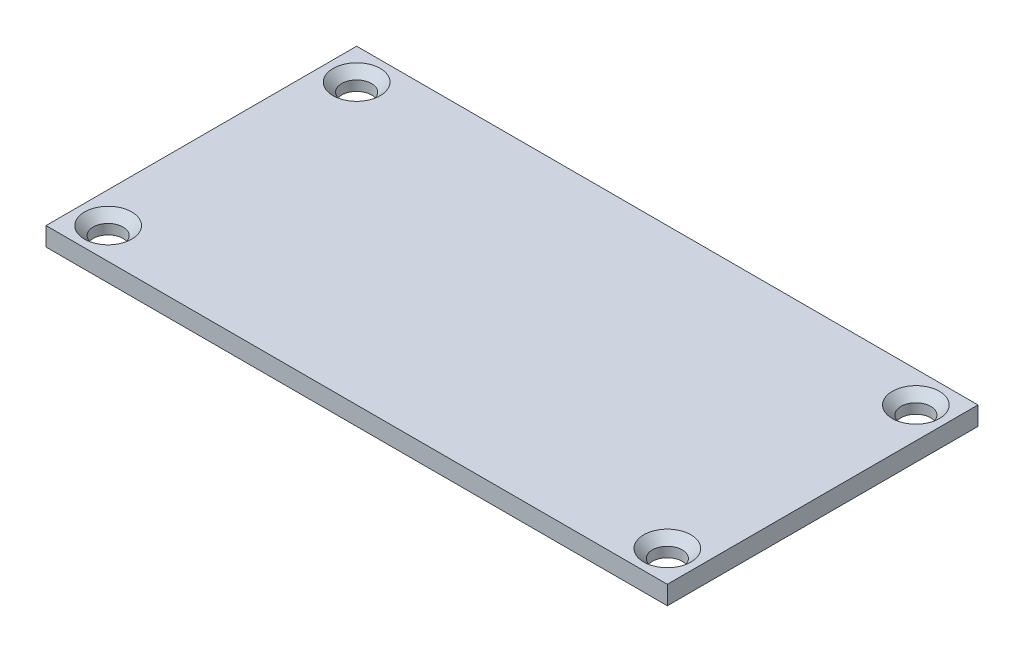
ISO-10303-21;
HEADER;
FILE_DESCRIPTION(('STEP AP214'),'2;1');
FILE_NAME('part.step','',(''),(''),'','','');
FILE_SCHEMA(('AUTOMOTIVE_DESIGN { 1 0 10303 214 1 1 1 1 }'));
ENDSEC;
DATA;
#1=APPLICATION_CONTEXT('core data for automotive mechanical design processes');
#2=APPLICATION_PROTOCOL_DEFINITION('international standard','automotive_design',2000,#1);
#3=PRODUCT_CONTEXT('',#1,'mechanical');
#4=PRODUCT('Part','Part','',(#3));
#5=PRODUCT_RELATED_PRODUCT_CATEGORY('part','',(#4));
#6=PRODUCT_DEFINITION_FORMATION('','',#4);
#7=PRODUCT_DEFINITION_CONTEXT('part definition',#1,'design');
#8=PRODUCT_DEFINITION('design','',#6,#7);
#9=PRODUCT_DEFINITION_SHAPE('','',#8);
#10=(LENGTH_UNIT() NAMED_UNIT(*) SI_UNIT(.MILLI.,.METRE.));
#11=(NAMED_UNIT(*) PLANE_ANGLE_UNIT() SI_UNIT($,.RADIAN.));
#12=(NAMED_UNIT(*) SI_UNIT($,.STERADIAN.) SOLID_ANGLE_UNIT());
#13=UNCERTAINTY_MEASURE_WITH_UNIT(LENGTH_MEASURE(1.E-05),#10,'distance_accuracy_value','');
#14=(GEOMETRIC_REPRESENTATION_CONTEXT(3) GLOBAL_UNCERTAINTY_ASSIGNED_CONTEXT((#13)) GLOBAL_UNIT_ASSIGNED_CONTEXT((#10,
#11,#12)) REPRESENTATION_CONTEXT('',''));
#15=CARTESIAN_POINT('',(0.,0.,0.));
#16=DIRECTION('',(0.,0.,1.));
#17=DIRECTION('',(1.,0.,0.));
#18=AXIS2_PLACEMENT_3D('',#15,#16,#17);
#19=CARTESIAN_POINT('',(47.5,1.5,-2.5));
#20=DIRECTION('',(0.,1.,0.));
#21=DIRECTION('',(0.,0.,1.));
#22=AXIS2_PLACEMENT_3D('',#19,#20,#21);
#23=CONICAL_SURFACE('',#22,1.9,0.78539816339745);
#24=CARTESIAN_POINT('',(47.5,0.800000000000001,-2.5));
#25=DIRECTION('',(0.,1.,0.));
#26=DIRECTION('',(0.,0.,1.));
#27=AXIS2_PLACEMENT_3D('',#24,#25,#26);
#28=CIRCLE('',#27,1.2);
#29=CARTESIAN_POINT('',(47.5,0.800000000000001,-1.3));
#30=VERTEX_POINT('',#29);
#31=EDGE_CURVE('E11',#30,#30,#28,.T.);
#32=ORIENTED_EDGE('',*,*,#31,.F.);
#33=EDGE_LOOP('',(#32));
#34=FACE_BOUND('',#33,.T.);
#35=CARTESIAN_POINT('',(47.5,1.5,-2.5));
#36=DIRECTION('',(0.,1.,0.));
#37=DIRECTION('',(0.,0.,1.));
#38=AXIS2_PLACEMENT_3D('',#35,#36,#37);
#39=CIRCLE('',#38,1.9);
#40=CARTESIAN_POINT('',(47.5,1.5,-0.600000000000002));
#41=VERTEX_POINT('',#40);
#42=EDGE_CURVE('E145',#41,#41,#39,.T.);
#43=ORIENTED_EDGE('',*,*,#42,.T.);
#44=EDGE_LOOP('',(#43));
#45=FACE_BOUND('',#44,.T.);
#46=ADVANCED_FACE('F39',(#34,#45),#23,.F.);
#47=CARTESIAN_POINT('',(47.5,1.5,-2.5));
#48=DIRECTION('',(0.,1.,0.));
#49=DIRECTION('',(0.,0.,1.));
#50=AXIS2_PLACEMENT_3D('',#47,#48,#49);
#51=CYLINDRICAL_SURFACE('',#50,1.2);
#52=CARTESIAN_POINT('',(47.5,0.,-2.5));
#53=DIRECTION('',(0.,-1.,0.));
#54=DIRECTION('',(0.,0.,-1.));
#55=AXIS2_PLACEMENT_3D('',#52,#53,#54);
#56=CIRCLE('',#55,1.2);
#57=CARTESIAN_POINT('',(47.5,0.,-3.7));
#58=VERTEX_POINT('',#57);
#59=EDGE_CURVE('E48',#58,#58,#56,.T.);
#60=ORIENTED_EDGE('',*,*,#59,.T.);
#61=EDGE_LOOP('',(#60));
#62=FACE_BOUND('',#61,.T.);
#63=ORIENTED_EDGE('',*,*,#31,.T.);
#64=EDGE_LOOP('',(#63));
#65=FACE_BOUND('',#64,.T.);
#66=ADVANCED_FACE('F152',(#62,#65),#51,.F.);
#67=CARTESIAN_POINT('',(2.5,1.5,-2.5));
#68=DIRECTION('',(0.,1.,0.));
#69=DIRECTION('',(0.,0.,1.));
#70=AXIS2_PLACEMENT_3D('',#67,#68,#69);
#71=CONICAL_SURFACE('',#70,1.9,0.78539816339745);
#72=CARTESIAN_POINT('',(2.5,0.800000000000001,-2.5));
#73=DIRECTION('',(0.,1.,0.));
#74=DIRECTION('',(0.,0.,1.));
#75=AXIS2_PLACEMENT_3D('',#72,#73,#74);
#76=CIRCLE('',#75,1.2);
#77=CARTESIAN_POINT('',(2.5,0.800000000000001,-1.3));
#78=VERTEX_POINT('',#77);
#79=EDGE_CURVE('E141',#78,#78,#76,.T.);
#80=ORIENTED_EDGE('',*,*,#79,.F.);
#81=EDGE_LOOP('',(#80));
#82=FACE_BOUND('',#81,.T.);
#83=CARTESIAN_POINT('',(2.5,1.5,-2.5));
#84=DIRECTION('',(0.,1.,0.));
#85=DIRECTION('',(0.,0.,1.));
#86=AXIS2_PLACEMENT_3D('',#83,#84,#85);
#87=CIRCLE('',#86,1.9);
#88=CARTESIAN_POINT('',(2.5,1.5,-0.600000000000002));
#89=VERTEX_POINT('',#88);
#90=EDGE_CURVE('E129',#89,#89,#87,.T.);
#91=ORIENTED_EDGE('',*,*,#90,.T.);
#92=EDGE_LOOP('',(#91));
#93=FACE_BOUND('',#92,.T.);
#94=ADVANCED_FACE('F178',(#82,#93),#71,.F.);
#95=CARTESIAN_POINT('',(2.5,1.5,-2.5));
#96=DIRECTION('',(0.,1.,0.));
#97=DIRECTION('',(0.,0.,1.));
#98=AXIS2_PLACEMENT_3D('',#95,#96,#97);
#99=CYLINDRICAL_SURFACE('',#98,1.2);
#100=CARTESIAN_POINT('',(2.5,0.,-2.5));
#101=DIRECTION('',(0.,-1.,0.));
#102=DIRECTION('',(0.,0.,-1.));
#103=AXIS2_PLACEMENT_3D('',#100,#101,#102);
#104=CIRCLE('',#103,1.2);
#105=CARTESIAN_POINT('',(2.5,0.,-3.7));
#106=VERTEX_POINT('',#105);
#107=EDGE_CURVE('E137',#106,#106,#104,.T.);
#108=ORIENTED_EDGE('',*,*,#107,.T.);
#109=EDGE_LOOP('',(#108));
#110=FACE_BOUND('',#109,.T.);
#111=ORIENTED_EDGE('',*,*,#79,.T.);
#112=EDGE_LOOP('',(#111));
#113=FACE_BOUND('',#112,.T.);
#114=ADVANCED_FACE('F186',(#110,#113),#99,.F.);
#115=CARTESIAN_POINT('',(0.,1.5,0.));
#116=DIRECTION('',(1.,0.,0.));
#117=DIRECTION('',(0.,0.,-1.));
#118=AXIS2_PLACEMENT_3D('',#115,#116,#117);
#119=PLANE('',#118);
#120=DIRECTION('',(0.,0.,1.));
#121=VECTOR('',#120,1.);
#122=CARTESIAN_POINT('',(0.,0.,0.));
#123=LINE('',#122,#121);
#124=CARTESIAN_POINT('',(0.,0.,-25.));
#125=VERTEX_POINT('',#124);
#126=CARTESIAN_POINT('',(0.,0.,0.));
#127=VERTEX_POINT('',#126);
#128=EDGE_CURVE('E112',#125,#127,#123,.T.);
#129=ORIENTED_EDGE('',*,*,#128,.T.);
#130=DIRECTION('',(0.,-1.,0.));
#131=VECTOR('',#130,1.);
#132=CARTESIAN_POINT('',(0.,1.5,0.));
#133=LINE('',#132,#131);
#134=CARTESIAN_POINT('',(0.,1.5,0.));
#135=VERTEX_POINT('',#134);
#136=EDGE_CURVE('E101',#135,#127,#133,.T.);
#137=ORIENTED_EDGE('',*,*,#136,.F.);
#138=DIRECTION('',(0.,0.,1.));
#139=VECTOR('',#138,1.);
#140=CARTESIAN_POINT('',(0.,1.5,0.));
#141=LINE('',#140,#139);
#142=CARTESIAN_POINT('',(0.,1.5,-25.));
#143=VERTEX_POINT('',#142);
#144=EDGE_CURVE('E93',#143,#135,#141,.T.);
#145=ORIENTED_EDGE('',*,*,#144,.F.);
#146=DIRECTION('',(0.,-1.,0.));
#147=VECTOR('',#146,1.);
#148=CARTESIAN_POINT('',(0.,1.5,-25.));
#149=LINE('',#148,#147);
#150=EDGE_CURVE('E108',#143,#125,#149,.T.);
#151=ORIENTED_EDGE('',*,*,#150,.T.);
#152=EDGE_LOOP('',(#129,#137,#145,#151));
#153=FACE_BOUND('',#152,.T.);
#154=ADVANCED_FACE('F192',(#153),#119,.F.);
#155=CARTESIAN_POINT('',(0.,1.5,0.));
#156=DIRECTION('',(0.,0.,-1.));
#157=DIRECTION('',(-1.,0.,0.));
#158=AXIS2_PLACEMENT_3D('',#155,#156,#157);
#159=PLANE('',#158);
#160=DIRECTION('',(1.,0.,0.));
#161=VECTOR('',#160,1.);
#162=CARTESIAN_POINT('',(0.,0.,0.));
#163=LINE('',#162,#161);
#164=CARTESIAN_POINT('',(50.,0.,0.));
#165=VERTEX_POINT('',#164);
#166=EDGE_CURVE('E99',#127,#165,#163,.T.);
#167=ORIENTED_EDGE('',*,*,#166,.T.);
#168=DIRECTION('',(0.,-1.,0.));
#169=VECTOR('',#168,1.);
#170=CARTESIAN_POINT('',(50.,1.5,0.));
#171=LINE('',#170,#169);
#172=CARTESIAN_POINT('',(50.,1.5,0.));
#173=VERTEX_POINT('',#172);
#174=EDGE_CURVE('E97',#173,#165,#171,.T.);
#175=ORIENTED_EDGE('',*,*,#174,.F.);
#176=DIRECTION('',(1.,0.,0.));
#177=VECTOR('',#176,1.);
#178=CARTESIAN_POINT('',(0.,1.5,0.));
#179=LINE('',#178,#177);
#180=EDGE_CURVE('E87',#135,#173,#179,.T.);
#181=ORIENTED_EDGE('',*,*,#180,.F.);
#182=ORIENTED_EDGE('',*,*,#136,.T.);
#183=EDGE_LOOP('',(#167,#175,#181,#182));
#184=FACE_BOUND('',#183,.T.);
#185=ADVANCED_FACE('F98',(#184),#159,.F.);
#186=CARTESIAN_POINT('',(50.,1.5,0.));
#187=DIRECTION('',(-1.,0.,0.));
#188=DIRECTION('',(0.,0.,1.));
#189=AXIS2_PLACEMENT_3D('',#186,#187,#188);
#190=PLANE('',#189);
#191=DIRECTION('',(0.,0.,-1.));
#192=VECTOR('',#191,1.);
#193=CARTESIAN_POINT('',(50.,0.,0.));
#194=LINE('',#193,#192);
#195=CARTESIAN_POINT('',(50.,0.,-25.));
#196=VERTEX_POINT('',#195);
#197=EDGE_CURVE('E73',#165,#196,#194,.T.);
#198=ORIENTED_EDGE('',*,*,#197,.T.);
#199=DIRECTION('',(0.,-1.,0.));
#200=VECTOR('',#199,1.);
#201=CARTESIAN_POINT('',(50.,1.5,-25.));
#202=LINE('',#201,#200);
#203=CARTESIAN_POINT('',(50.,1.5,-25.));
#204=VERTEX_POINT('',#203);
#205=EDGE_CURVE('E102',#204,#196,#202,.T.);
#206=ORIENTED_EDGE('',*,*,#205,.F.);
#207=DIRECTION('',(0.,0.,-1.));
#208=VECTOR('',#207,1.);
#209=CARTESIAN_POINT('',(50.,1.5,0.));
#210=LINE('',#209,#208);
#211=EDGE_CURVE('E91',#173,#204,#210,.T.);
#212=ORIENTED_EDGE('',*,*,#211,.F.);
#213=ORIENTED_EDGE('',*,*,#174,.T.);
#214=EDGE_LOOP('',(#198,#206,#212,#213));
#215=FACE_BOUND('',#214,.T.);
#216=ADVANCED_FACE('F104',(#215),#190,.F.);
#217=CARTESIAN_POINT('',(0.,1.5,-25.));
#218=DIRECTION('',(0.,0.,1.));
#219=DIRECTION('',(1.,0.,0.));
#220=AXIS2_PLACEMENT_3D('',#217,#218,#219);
#221=PLANE('',#220);
#222=DIRECTION('',(-1.,0.,0.));
#223=VECTOR('',#222,1.);
#224=CARTESIAN_POINT('',(0.,0.,-25.));
#225=LINE('',#224,#223);
#226=EDGE_CURVE('E79',#196,#125,#225,.T.);
#227=ORIENTED_EDGE('',*,*,#226,.T.);
#228=ORIENTED_EDGE('',*,*,#150,.F.);
#229=DIRECTION('',(-1.,0.,0.));
#230=VECTOR('',#229,1.);
#231=CARTESIAN_POINT('',(0.,1.5,-25.));
#232=LINE('',#231,#230);
#233=EDGE_CURVE('E56',#204,#143,#232,.T.);
#234=ORIENTED_EDGE('',*,*,#233,.F.);
#235=ORIENTED_EDGE('',*,*,#205,.T.);
#236=EDGE_LOOP('',(#227,#228,#234,#235));
#237=FACE_BOUND('',#236,.T.);
#238=ADVANCED_FACE('F167',(#237),#221,.F.);
#239=CARTESIAN_POINT('',(0.,1.5,0.));
#240=DIRECTION('',(0.,-1.,0.));
#241=DIRECTION('',(0.,0.,-1.));
#242=AXIS2_PLACEMENT_3D('',#239,#240,#241);
#243=PLANE('',#242);
#244=CARTESIAN_POINT('',(47.5,1.5,-22.5));
#245=DIRECTION('',(0.,1.,0.));
#246=DIRECTION('',(0.,0.,1.));
#247=AXIS2_PLACEMENT_3D('',#244,#245,#246);
#248=CIRCLE('',#247,1.9);
#249=CARTESIAN_POINT('',(47.5,1.5,-20.6));
#250=VERTEX_POINT('',#249);
#251=EDGE_CURVE('E271',#250,#250,#248,.T.);
#252=ORIENTED_EDGE('',*,*,#251,.F.);
#253=EDGE_LOOP('',(#252));
#254=FACE_BOUND('',#253,.T.);
#255=CARTESIAN_POINT('',(2.5,1.5,-22.5));
#256=DIRECTION('',(0.,1.,0.));
#257=DIRECTION('',(0.,0.,1.));
#258=AXIS2_PLACEMENT_3D('',#255,#256,#257);
#259=CIRCLE('',#258,1.9);
#260=CARTESIAN_POINT('',(2.5,1.5,-20.6));
#261=VERTEX_POINT('',#260);
#262=EDGE_CURVE('E255',#261,#261,#259,.T.);
#263=ORIENTED_EDGE('',*,*,#262,.F.);
#264=EDGE_LOOP('',(#263));
#265=FACE_BOUND('',#264,.T.);
#266=ORIENTED_EDGE('',*,*,#144,.T.);
#267=ORIENTED_EDGE('',*,*,#180,.T.);
#268=ORIENTED_EDGE('',*,*,#211,.T.);
#269=ORIENTED_EDGE('',*,*,#233,.T.);
#270=EDGE_LOOP('',(#266,#267,#268,#269));
#271=FACE_BOUND('',#270,.T.);
#272=ORIENTED_EDGE('',*,*,#90,.F.);
#273=EDGE_LOOP('',(#272));
#274=FACE_BOUND('',#273,.T.);
#275=ORIENTED_EDGE('',*,*,#42,.F.);
#276=EDGE_LOOP('',(#275));
#277=FACE_BOUND('',#276,.T.);
#278=ADVANCED_FACE('F88',(#254,#265,#271,#274,#277),#243,.F.);
#279=CARTESIAN_POINT('',(0.,0.,0.));
#280=DIRECTION('',(0.,-1.,0.));
#281=DIRECTION('',(0.,0.,-1.));
#282=AXIS2_PLACEMENT_3D('',#279,#280,#281);
#283=PLANE('',#282);
#284=CARTESIAN_POINT('',(47.5,0.,-22.5));
#285=DIRECTION('',(0.,-1.,0.));
#286=DIRECTION('',(0.,0.,-1.));
#287=AXIS2_PLACEMENT_3D('',#284,#285,#286);
#288=CIRCLE('',#287,1.2);
#289=CARTESIAN_POINT('',(47.5,0.,-23.7));
#290=VERTEX_POINT('',#289);
#291=EDGE_CURVE('E264',#290,#290,#288,.T.);
#292=ORIENTED_EDGE('',*,*,#291,.F.);
#293=EDGE_LOOP('',(#292));
#294=FACE_BOUND('',#293,.T.);
#295=CARTESIAN_POINT('',(2.5,0.,-22.5));
#296=DIRECTION('',(0.,-1.,0.));
#297=DIRECTION('',(0.,0.,-1.));
#298=AXIS2_PLACEMENT_3D('',#295,#296,#297);
#299=CIRCLE('',#298,1.2);
#300=CARTESIAN_POINT('',(2.5,0.,-23.7));
#301=VERTEX_POINT('',#300);
#302=EDGE_CURVE('E116',#301,#301,#299,.T.);
#303=ORIENTED_EDGE('',*,*,#302,.F.);
#304=EDGE_LOOP('',(#303));
#305=FACE_BOUND('',#304,.T.);
#306=ORIENTED_EDGE('',*,*,#128,.F.);
#307=ORIENTED_EDGE('',*,*,#226,.F.);
#308=ORIENTED_EDGE('',*,*,#197,.F.);
#309=ORIENTED_EDGE('',*,*,#166,.F.);
#310=EDGE_LOOP('',(#306,#307,#308,#309));
#311=FACE_BOUND('',#310,.T.);
#312=ORIENTED_EDGE('',*,*,#107,.F.);
#313=EDGE_LOOP('',(#312));
#314=FACE_BOUND('',#313,.T.);
#315=ORIENTED_EDGE('',*,*,#59,.F.);
#316=EDGE_LOOP('',(#315));
#317=FACE_BOUND('',#316,.T.);
#318=ADVANCED_FACE('F155',(#294,#305,#311,#314,#317),#283,.T.);
#319=CARTESIAN_POINT('',(2.5,1.5,-22.5));
#320=DIRECTION('',(0.,1.,0.));
#321=DIRECTION('',(0.,0.,1.));
#322=AXIS2_PLACEMENT_3D('',#319,#320,#321);
#323=CYLINDRICAL_SURFACE('',#322,1.2);
#324=ORIENTED_EDGE('',*,*,#302,.T.);
#325=EDGE_LOOP('',(#324));
#326=FACE_BOUND('',#325,.T.);
#327=CARTESIAN_POINT('',(2.5,0.800000000000001,-22.5));
#328=DIRECTION('',(0.,1.,0.));
#329=DIRECTION('',(0.,0.,1.));
#330=AXIS2_PLACEMENT_3D('',#327,#328,#329);
#331=CIRCLE('',#330,1.2);
#332=CARTESIAN_POINT('',(2.5,0.800000000000001,-21.3));
#333=VERTEX_POINT('',#332);
#334=EDGE_CURVE('E133',#333,#333,#331,.T.);
#335=ORIENTED_EDGE('',*,*,#334,.T.);
#336=EDGE_LOOP('',(#335));
#337=FACE_BOUND('',#336,.T.);
#338=ADVANCED_FACE('F157',(#326,#337),#323,.F.);
#339=CARTESIAN_POINT('',(2.5,1.5,-22.5));
#340=DIRECTION('',(0.,1.,0.));
#341=DIRECTION('',(0.,0.,1.));
#342=AXIS2_PLACEMENT_3D('',#339,#340,#341);
#343=CONICAL_SURFACE('',#342,1.9,0.78539816339745);
#344=ORIENTED_EDGE('',*,*,#334,.F.);
#345=EDGE_LOOP('',(#344));
#346=FACE_BOUND('',#345,.T.);
#347=ORIENTED_EDGE('',*,*,#262,.T.);
#348=EDGE_LOOP('',(#347));
#349=FACE_BOUND('',#348,.T.);
#350=ADVANCED_FACE('F164',(#346,#349),#343,.F.);
#351=CARTESIAN_POINT('',(47.5,1.5,-22.5));
#352=DIRECTION('',(0.,1.,0.));
#353=DIRECTION('',(0.,0.,1.));
#354=AXIS2_PLACEMENT_3D('',#351,#352,#353);
#355=CYLINDRICAL_SURFACE('',#354,1.2);
#356=ORIENTED_EDGE('',*,*,#291,.T.);
#357=EDGE_LOOP('',(#356));
#358=FACE_BOUND('',#357,.T.);
#359=CARTESIAN_POINT('',(47.5,0.800000000000001,-22.5));
#360=DIRECTION('',(0.,1.,0.));
#361=DIRECTION('',(0.,0.,1.));
#362=AXIS2_PLACEMENT_3D('',#359,#360,#361);
#363=CIRCLE('',#362,1.2);
#364=CARTESIAN_POINT('',(47.5,0.800000000000001,-21.3));
#365=VERTEX_POINT('',#364);
#366=EDGE_CURVE('E258',#365,#365,#363,.T.);
#367=ORIENTED_EDGE('',*,*,#366,.T.);
#368=EDGE_LOOP('',(#367));
#369=FACE_BOUND('',#368,.T.);
#370=ADVANCED_FACE('F224',(#358,#369),#355,.F.);
#371=CARTESIAN_POINT('',(47.5,1.5,-22.5));
#372=DIRECTION('',(0.,1.,0.));
#373=DIRECTION('',(0.,0.,1.));
#374=AXIS2_PLACEMENT_3D('',#371,#372,#373);
#375=CONICAL_SURFACE('',#374,1.9,0.78539816339745);
#376=ORIENTED_EDGE('',*,*,#366,.F.);
#377=EDGE_LOOP('',(#376));
#378=FACE_BOUND('',#377,.T.);
#379=ORIENTED_EDGE('',*,*,#251,.T.);
#380=EDGE_LOOP('',(#379));
#381=FACE_BOUND('',#380,.T.);
#382=ADVANCED_FACE('F229',(#378,#381),#375,.F.);
#383=CLOSED_SHELL('',(#46,#66,#94,#114,#154,#185,#216,#238,#278,#318,#338,#350,#370,#382));
#384=MANIFOLD_SOLID_BREP('B2',#383);
#385=ADVANCED_BREP_SHAPE_REPRESENTATION('',(#18,#384),#14);
#386=SHAPE_DEFINITION_REPRESENTATION(#9,#385);
ENDSEC;
END-ISO-10303-21;
